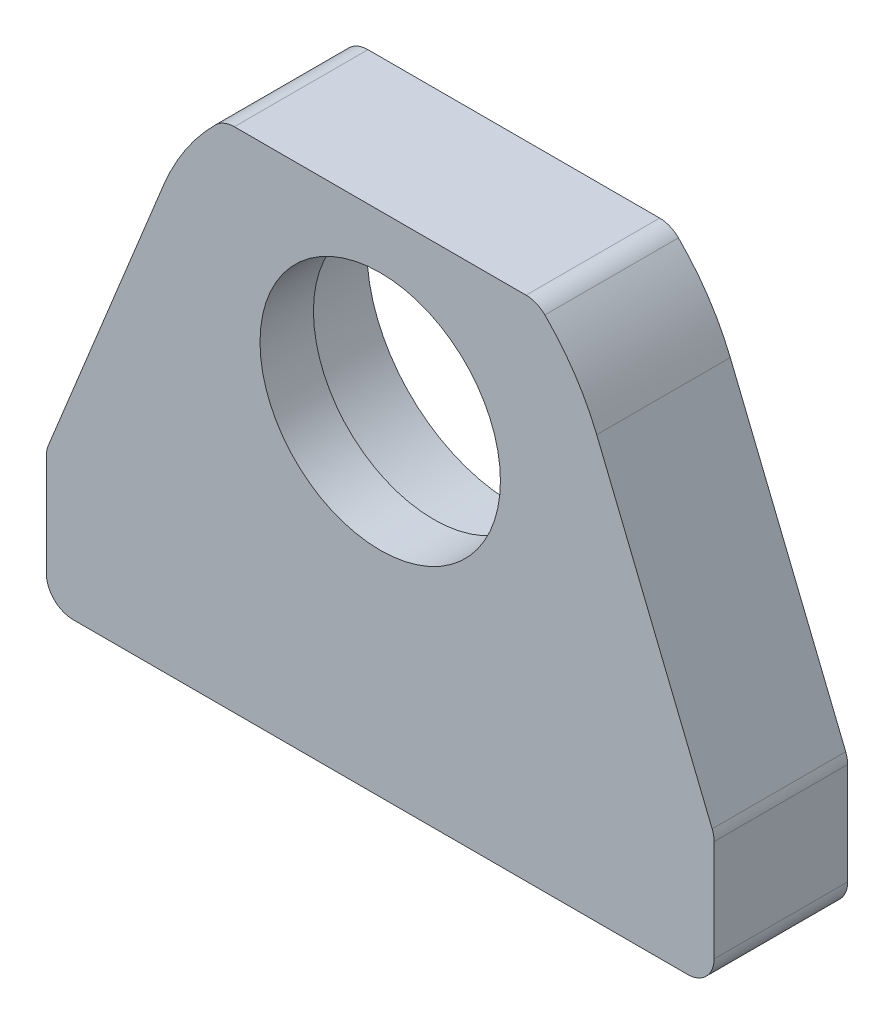
ISO-10303-21;
HEADER;
FILE_DESCRIPTION(('STEP AP214'),'2;1');
FILE_NAME('part.step','',(''),(''),'','','');
FILE_SCHEMA(('AUTOMOTIVE_DESIGN { 1 0 10303 214 1 1 1 1 }'));
ENDSEC;
DATA;
#1=APPLICATION_CONTEXT('core data for automotive mechanical design processes');
#2=APPLICATION_PROTOCOL_DEFINITION('international standard','automotive_design',2000,#1);
#3=PRODUCT_CONTEXT('',#1,'mechanical');
#4=PRODUCT('Part','Part','',(#3));
#5=PRODUCT_RELATED_PRODUCT_CATEGORY('part','',(#4));
#6=PRODUCT_DEFINITION_FORMATION('','',#4);
#7=PRODUCT_DEFINITION_CONTEXT('part definition',#1,'design');
#8=PRODUCT_DEFINITION('design','',#6,#7);
#9=PRODUCT_DEFINITION_SHAPE('','',#8);
#10=(LENGTH_UNIT() NAMED_UNIT(*) SI_UNIT(.MILLI.,.METRE.));
#11=(NAMED_UNIT(*) PLANE_ANGLE_UNIT() SI_UNIT($,.RADIAN.));
#12=(NAMED_UNIT(*) SI_UNIT($,.STERADIAN.) SOLID_ANGLE_UNIT());
#13=UNCERTAINTY_MEASURE_WITH_UNIT(LENGTH_MEASURE(1.E-05),#10,'distance_accuracy_value','');
#14=(GEOMETRIC_REPRESENTATION_CONTEXT(3) GLOBAL_UNCERTAINTY_ASSIGNED_CONTEXT((#13)) GLOBAL_UNIT_ASSIGNED_CONTEXT((#10,
#11,#12)) REPRESENTATION_CONTEXT('',''));
#15=CARTESIAN_POINT('',(0.,0.,0.));
#16=DIRECTION('',(0.,0.,1.));
#17=DIRECTION('',(1.,0.,0.));
#18=AXIS2_PLACEMENT_3D('',#15,#16,#17);
#19=CARTESIAN_POINT('',(25.,-15.,10.));
#20=DIRECTION('',(-1.,0.,0.));
#21=DIRECTION('',(0.,-1.,0.));
#22=AXIS2_PLACEMENT_3D('',#19,#20,#21);
#23=PLANE('',#22);
#24=DIRECTION('',(0.,1.,0.));
#25=VECTOR('',#24,1.);
#26=CARTESIAN_POINT('',(25.,-15.,10.));
#27=LINE('',#26,#25);
#28=CARTESIAN_POINT('',(25.,-23.,10.));
#29=VERTEX_POINT('',#28);
#30=CARTESIAN_POINT('',(25.,-15.3914563591869,10.));
#31=VERTEX_POINT('',#30);
#32=EDGE_CURVE('E150',#29,#31,#27,.T.);
#33=ORIENTED_EDGE('',*,*,#32,.F.);
#34=DIRECTION('',(0.,0.,-1.));
#35=VECTOR('',#34,1.);
#36=CARTESIAN_POINT('',(25.,-23.,10.));
#37=LINE('',#36,#35);
#38=CARTESIAN_POINT('',(25.,-23.,0.));
#39=VERTEX_POINT('',#38);
#40=EDGE_CURVE('E202',#29,#39,#37,.T.);
#41=ORIENTED_EDGE('',*,*,#40,.T.);
#42=DIRECTION('',(0.,1.,0.));
#43=VECTOR('',#42,1.);
#44=CARTESIAN_POINT('',(25.,-15.,0.));
#45=LINE('',#44,#43);
#46=CARTESIAN_POINT('',(25.,-15.3914563591869,0.));
#47=VERTEX_POINT('',#46);
#48=EDGE_CURVE('E179',#39,#47,#45,.T.);
#49=ORIENTED_EDGE('',*,*,#48,.T.);
#50=DIRECTION('',(0.,0.,-1.));
#51=VECTOR('',#50,1.);
#52=CARTESIAN_POINT('',(25.,-15.3914563591869,10.));
#53=LINE('',#52,#51);
#54=EDGE_CURVE('E160',#47,#31,#53,.F.);
#55=ORIENTED_EDGE('',*,*,#54,.T.);
#56=EDGE_LOOP('',(#33,#41,#49,#55));
#57=FACE_BOUND('',#56,.T.);
#58=ADVANCED_FACE('F35',(#57),#23,.F.);
#59=CARTESIAN_POINT('',(25.,-15.,10.));
#60=DIRECTION('',(-0.926207899400977,-0.377013165668295,0.));
#61=DIRECTION('',(0.377013165668295,-0.926207899400977,0.));
#62=AXIS2_PLACEMENT_3D('',#59,#60,#61);
#63=PLANE('',#62);
#64=DIRECTION('',(-0.377013165668295,0.926207899400977,0.));
#65=VECTOR('',#64,1.);
#66=CARTESIAN_POINT('',(25.,-15.,10.));
#67=LINE('',#66,#65);
#68=CARTESIAN_POINT('',(24.852415798802,-14.6374300278503,10.));
#69=VERTEX_POINT('',#68);
#70=CARTESIAN_POINT('',(16.2086382395171,6.59773039919516,10.));
#71=VERTEX_POINT('',#70);
#72=EDGE_CURVE('E137',#69,#71,#67,.T.);
#73=ORIENTED_EDGE('',*,*,#72,.F.);
#74=DIRECTION('',(0.,0.,-1.));
#75=VECTOR('',#74,1.);
#76=CARTESIAN_POINT('',(24.852415798802,-14.6374300278503,10.));
#77=LINE('',#76,#75);
#78=CARTESIAN_POINT('',(24.852415798802,-14.6374300278503,0.));
#79=VERTEX_POINT('',#78);
#80=EDGE_CURVE('E238',#69,#79,#77,.T.);
#81=ORIENTED_EDGE('',*,*,#80,.T.);
#82=DIRECTION('',(-0.377013165668295,0.926207899400977,0.));
#83=VECTOR('',#82,1.);
#84=CARTESIAN_POINT('',(25.,-15.,0.));
#85=LINE('',#84,#83);
#86=CARTESIAN_POINT('',(16.2086382395171,6.59773039919516,0.));
#87=VERTEX_POINT('',#86);
#88=EDGE_CURVE('E156',#79,#87,#85,.T.);
#89=ORIENTED_EDGE('',*,*,#88,.T.);
#90=DIRECTION('',(0.,0.,-1.));
#91=VECTOR('',#90,1.);
#92=CARTESIAN_POINT('',(16.2086382395171,6.59773039919516,10.));
#93=LINE('',#92,#91);
#94=EDGE_CURVE('E153',#71,#87,#93,.T.);
#95=ORIENTED_EDGE('',*,*,#94,.F.);
#96=EDGE_LOOP('',(#73,#81,#89,#95));
#97=FACE_BOUND('',#96,.T.);
#98=ADVANCED_FACE('F154',(#97),#63,.F.);
#99=CARTESIAN_POINT('',(0.,0.,10.));
#100=DIRECTION('',(0.,0.,-1.));
#101=DIRECTION('',(-1.,0.,0.));
#102=AXIS2_PLACEMENT_3D('',#99,#100,#101);
#103=CYLINDRICAL_SURFACE('',#102,17.5);
#104=CARTESIAN_POINT('',(0.,0.,0.));
#105=DIRECTION('',(0.,0.,1.));
#106=DIRECTION('',(1.,0.,0.));
#107=AXIS2_PLACEMENT_3D('',#104,#105,#106);
#108=CIRCLE('',#107,17.5);
#109=CARTESIAN_POINT('',(12.3292183608783,12.4193548387097,0.));
#110=VERTEX_POINT('',#109);
#111=EDGE_CURVE('E184',#87,#110,#108,.T.);
#112=ORIENTED_EDGE('',*,*,#111,.T.);
#113=DIRECTION('',(0.,0.,-1.));
#114=VECTOR('',#113,1.);
#115=CARTESIAN_POINT('',(12.3292183608783,12.4193548387097,10.));
#116=LINE('',#115,#114);
#117=CARTESIAN_POINT('',(12.3292183608783,12.4193548387097,10.));
#118=VERTEX_POINT('',#117);
#119=EDGE_CURVE('E43',#110,#118,#116,.F.);
#120=ORIENTED_EDGE('',*,*,#119,.T.);
#121=CARTESIAN_POINT('',(0.,0.,10.));
#122=DIRECTION('',(0.,0.,1.));
#123=DIRECTION('',(1.,0.,0.));
#124=AXIS2_PLACEMENT_3D('',#121,#122,#123);
#125=CIRCLE('',#124,17.5);
#126=EDGE_CURVE('E142',#71,#118,#125,.T.);
#127=ORIENTED_EDGE('',*,*,#126,.F.);
#128=ORIENTED_EDGE('',*,*,#94,.T.);
#129=EDGE_LOOP('',(#112,#120,#127,#128));
#130=FACE_BOUND('',#129,.T.);
#131=ADVANCED_FACE('F163',(#130),#103,.T.);
#132=CARTESIAN_POINT('',(-11.71537451386,13.,10.));
#133=DIRECTION('',(0.,-1.,0.));
#134=DIRECTION('',(0.,0.,-1.));
#135=AXIS2_PLACEMENT_3D('',#132,#133,#134);
#136=PLANE('',#135);
#137=DIRECTION('',(-1.,0.,0.));
#138=VECTOR('',#137,1.);
#139=CARTESIAN_POINT('',(-11.71537451386,13.,10.));
#140=LINE('',#139,#138);
#141=CARTESIAN_POINT('',(10.9201648339208,13.,10.));
#142=VERTEX_POINT('',#141);
#143=CARTESIAN_POINT('',(-10.9201648339208,13.,10.));
#144=VERTEX_POINT('',#143);
#145=EDGE_CURVE('E165',#142,#144,#140,.T.);
#146=ORIENTED_EDGE('',*,*,#145,.F.);
#147=DIRECTION('',(0.,0.,-1.));
#148=VECTOR('',#147,1.);
#149=CARTESIAN_POINT('',(10.9201648339208,13.,10.));
#150=LINE('',#149,#148);
#151=CARTESIAN_POINT('',(10.9201648339208,13.,0.));
#152=VERTEX_POINT('',#151);
#153=EDGE_CURVE('E242',#142,#152,#150,.T.);
#154=ORIENTED_EDGE('',*,*,#153,.T.);
#155=DIRECTION('',(-1.,0.,0.));
#156=VECTOR('',#155,1.);
#157=CARTESIAN_POINT('',(-11.71537451386,13.,0.));
#158=LINE('',#157,#156);
#159=CARTESIAN_POINT('',(-10.9201648339208,13.,0.));
#160=VERTEX_POINT('',#159);
#161=EDGE_CURVE('E186',#152,#160,#158,.T.);
#162=ORIENTED_EDGE('',*,*,#161,.T.);
#163=DIRECTION('',(0.,0.,-1.));
#164=VECTOR('',#163,1.);
#165=CARTESIAN_POINT('',(-10.9201648339208,13.,10.));
#166=LINE('',#165,#164);
#167=EDGE_CURVE('E240',#160,#144,#166,.F.);
#168=ORIENTED_EDGE('',*,*,#167,.T.);
#169=EDGE_LOOP('',(#146,#154,#162,#168));
#170=FACE_BOUND('',#169,.T.);
#171=ADVANCED_FACE('F248',(#170),#136,.F.);
#172=CARTESIAN_POINT('',(0.,0.,10.));
#173=DIRECTION('',(0.,0.,-1.));
#174=DIRECTION('',(-1.,0.,0.));
#175=AXIS2_PLACEMENT_3D('',#172,#173,#174);
#176=CYLINDRICAL_SURFACE('',#175,17.5);
#177=CARTESIAN_POINT('',(0.,0.,10.));
#178=DIRECTION('',(0.,0.,1.));
#179=DIRECTION('',(1.,0.,0.));
#180=AXIS2_PLACEMENT_3D('',#177,#178,#179);
#181=CIRCLE('',#180,17.5);
#182=CARTESIAN_POINT('',(-12.3292183608783,12.4193548387097,10.));
#183=VERTEX_POINT('',#182);
#184=CARTESIAN_POINT('',(-16.2086382395171,6.59773039919516,10.));
#185=VERTEX_POINT('',#184);
#186=EDGE_CURVE('E168',#183,#185,#181,.T.);
#187=ORIENTED_EDGE('',*,*,#186,.F.);
#188=DIRECTION('',(0.,0.,-1.));
#189=VECTOR('',#188,1.);
#190=CARTESIAN_POINT('',(-12.3292183608783,12.4193548387097,10.));
#191=LINE('',#190,#189);
#192=CARTESIAN_POINT('',(-12.3292183608783,12.4193548387097,0.));
#193=VERTEX_POINT('',#192);
#194=EDGE_CURVE('E11',#183,#193,#191,.T.);
#195=ORIENTED_EDGE('',*,*,#194,.T.);
#196=CARTESIAN_POINT('',(0.,0.,0.));
#197=DIRECTION('',(0.,0.,1.));
#198=DIRECTION('',(1.,0.,0.));
#199=AXIS2_PLACEMENT_3D('',#196,#197,#198);
#200=CIRCLE('',#199,17.5);
#201=CARTESIAN_POINT('',(-16.2086382395171,6.59773039919516,0.));
#202=VERTEX_POINT('',#201);
#203=EDGE_CURVE('E189',#193,#202,#200,.T.);
#204=ORIENTED_EDGE('',*,*,#203,.T.);
#205=DIRECTION('',(0.,0.,-1.));
#206=VECTOR('',#205,1.);
#207=CARTESIAN_POINT('',(-16.2086382395171,6.59773039919516,10.));
#208=LINE('',#207,#206);
#209=EDGE_CURVE('E161',#185,#202,#208,.T.);
#210=ORIENTED_EDGE('',*,*,#209,.F.);
#211=EDGE_LOOP('',(#187,#195,#204,#210));
#212=FACE_BOUND('',#211,.T.);
#213=ADVANCED_FACE('F261',(#212),#176,.T.);
#214=CARTESIAN_POINT('',(-25.,-15.,10.));
#215=DIRECTION('',(0.926207899400977,-0.377013165668295,0.));
#216=DIRECTION('',(0.377013165668295,0.926207899400977,0.));
#217=AXIS2_PLACEMENT_3D('',#214,#215,#216);
#218=PLANE('',#217);
#219=DIRECTION('',(-0.377013165668295,-0.926207899400977,0.));
#220=VECTOR('',#219,1.);
#221=CARTESIAN_POINT('',(-25.,-15.,0.));
#222=LINE('',#221,#220);
#223=CARTESIAN_POINT('',(-24.852415798802,-14.6374300278503,0.));
#224=VERTEX_POINT('',#223);
#225=EDGE_CURVE('E191',#202,#224,#222,.T.);
#226=ORIENTED_EDGE('',*,*,#225,.T.);
#227=DIRECTION('',(0.,0.,-1.));
#228=VECTOR('',#227,1.);
#229=CARTESIAN_POINT('',(-24.852415798802,-14.6374300278503,10.));
#230=LINE('',#229,#228);
#231=CARTESIAN_POINT('',(-24.852415798802,-14.6374300278503,10.));
#232=VERTEX_POINT('',#231);
#233=EDGE_CURVE('E236',#224,#232,#230,.F.);
#234=ORIENTED_EDGE('',*,*,#233,.T.);
#235=DIRECTION('',(-0.377013165668295,-0.926207899400977,0.));
#236=VECTOR('',#235,1.);
#237=CARTESIAN_POINT('',(-25.,-15.,10.));
#238=LINE('',#237,#236);
#239=EDGE_CURVE('E173',#185,#232,#238,.T.);
#240=ORIENTED_EDGE('',*,*,#239,.F.);
#241=ORIENTED_EDGE('',*,*,#209,.T.);
#242=EDGE_LOOP('',(#226,#234,#240,#241));
#243=FACE_BOUND('',#242,.T.);
#244=ADVANCED_FACE('F368',(#243),#218,.F.);
#245=CARTESIAN_POINT('',(-25.,-15.,10.));
#246=DIRECTION('',(1.,0.,0.));
#247=DIRECTION('',(0.,0.,-1.));
#248=AXIS2_PLACEMENT_3D('',#245,#246,#247);
#249=PLANE('',#248);
#250=DIRECTION('',(0.,-1.,0.));
#251=VECTOR('',#250,1.);
#252=CARTESIAN_POINT('',(-25.,-15.,0.));
#253=LINE('',#252,#251);
#254=CARTESIAN_POINT('',(-25.,-15.3914563591869,0.));
#255=VERTEX_POINT('',#254);
#256=CARTESIAN_POINT('',(-25.,-23.,0.));
#257=VERTEX_POINT('',#256);
#258=EDGE_CURVE('E194',#255,#257,#253,.T.);
#259=ORIENTED_EDGE('',*,*,#258,.T.);
#260=DIRECTION('',(0.,0.,-1.));
#261=VECTOR('',#260,1.);
#262=CARTESIAN_POINT('',(-25.,-23.,10.));
#263=LINE('',#262,#261);
#264=CARTESIAN_POINT('',(-25.,-23.,10.));
#265=VERTEX_POINT('',#264);
#266=EDGE_CURVE('E50',#257,#265,#263,.F.);
#267=ORIENTED_EDGE('',*,*,#266,.T.);
#268=DIRECTION('',(0.,-1.,0.));
#269=VECTOR('',#268,1.);
#270=CARTESIAN_POINT('',(-25.,-15.,10.));
#271=LINE('',#270,#269);
#272=CARTESIAN_POINT('',(-25.,-15.3914563591869,10.));
#273=VERTEX_POINT('',#272);
#274=EDGE_CURVE('E175',#273,#265,#271,.T.);
#275=ORIENTED_EDGE('',*,*,#274,.F.);
#276=DIRECTION('',(0.,0.,-1.));
#277=VECTOR('',#276,1.);
#278=CARTESIAN_POINT('',(-25.,-15.3914563591869,10.));
#279=LINE('',#278,#277);
#280=EDGE_CURVE('E232',#273,#255,#279,.T.);
#281=ORIENTED_EDGE('',*,*,#280,.T.);
#282=EDGE_LOOP('',(#259,#267,#275,#281));
#283=FACE_BOUND('',#282,.T.);
#284=ADVANCED_FACE('F300',(#283),#249,.F.);
#285=CARTESIAN_POINT('',(-25.,-25.,10.));
#286=DIRECTION('',(0.,1.,0.));
#287=DIRECTION('',(-1.,0.,0.));
#288=AXIS2_PLACEMENT_3D('',#285,#286,#287);
#289=PLANE('',#288);
#290=CARTESIAN_POINT('',(-20.,-25.,5.));
#291=DIRECTION('',(0.,-1.,0.));
#292=DIRECTION('',(1.,0.,0.));
#293=AXIS2_PLACEMENT_3D('',#290,#291,#292);
#294=CIRCLE('',#293,1.65);
#295=CARTESIAN_POINT('',(-18.35,-25.,5.));
#296=VERTEX_POINT('',#295);
#297=EDGE_CURVE('E325',#296,#296,#294,.T.);
#298=ORIENTED_EDGE('',*,*,#297,.F.);
#299=EDGE_LOOP('',(#298));
#300=FACE_BOUND('',#299,.T.);
#301=CARTESIAN_POINT('',(20.,-25.,5.));
#302=DIRECTION('',(0.,-1.,0.));
#303=DIRECTION('',(-1.,0.,0.));
#304=AXIS2_PLACEMENT_3D('',#301,#302,#303);
#305=CIRCLE('',#304,1.65);
#306=CARTESIAN_POINT('',(18.35,-25.,5.));
#307=VERTEX_POINT('',#306);
#308=EDGE_CURVE('E318',#307,#307,#305,.T.);
#309=ORIENTED_EDGE('',*,*,#308,.F.);
#310=EDGE_LOOP('',(#309));
#311=FACE_BOUND('',#310,.T.);
#312=DIRECTION('',(1.,0.,0.));
#313=VECTOR('',#312,1.);
#314=CARTESIAN_POINT('',(-25.,-25.,0.));
#315=LINE('',#314,#313);
#316=CARTESIAN_POINT('',(-23.,-25.,0.));
#317=VERTEX_POINT('',#316);
#318=CARTESIAN_POINT('',(23.,-25.,0.));
#319=VERTEX_POINT('',#318);
#320=EDGE_CURVE('E196',#317,#319,#315,.T.);
#321=ORIENTED_EDGE('',*,*,#320,.T.);
#322=DIRECTION('',(0.,0.,-1.));
#323=VECTOR('',#322,1.);
#324=CARTESIAN_POINT('',(23.,-25.,10.));
#325=LINE('',#324,#323);
#326=CARTESIAN_POINT('',(23.,-25.,10.));
#327=VERTEX_POINT('',#326);
#328=EDGE_CURVE('E220',#319,#327,#325,.F.);
#329=ORIENTED_EDGE('',*,*,#328,.T.);
#330=DIRECTION('',(1.,0.,0.));
#331=VECTOR('',#330,1.);
#332=CARTESIAN_POINT('',(-25.,-25.,10.));
#333=LINE('',#332,#331);
#334=CARTESIAN_POINT('',(-23.,-25.,10.));
#335=VERTEX_POINT('',#334);
#336=EDGE_CURVE('E177',#335,#327,#333,.T.);
#337=ORIENTED_EDGE('',*,*,#336,.F.);
#338=DIRECTION('',(0.,0.,-1.));
#339=VECTOR('',#338,1.);
#340=CARTESIAN_POINT('',(-23.,-25.,10.));
#341=LINE('',#340,#339);
#342=EDGE_CURVE('E217',#335,#317,#341,.T.);
#343=ORIENTED_EDGE('',*,*,#342,.T.);
#344=EDGE_LOOP('',(#321,#329,#337,#343));
#345=FACE_BOUND('',#344,.T.);
#346=ADVANCED_FACE('F306',(#300,#311,#345),#289,.F.);
#347=CARTESIAN_POINT('',(0.,0.,10.));
#348=DIRECTION('',(0.,0.,1.));
#349=DIRECTION('',(1.,0.,0.));
#350=AXIS2_PLACEMENT_3D('',#347,#348,#349);
#351=PLANE('',#350);
#352=CARTESIAN_POINT('',(0.,0.,10.));
#353=DIRECTION('',(0.,0.,-1.));
#354=DIRECTION('',(-1.,0.,0.));
#355=AXIS2_PLACEMENT_3D('',#352,#353,#354);
#356=CIRCLE('',#355,9.);
#357=CARTESIAN_POINT('',(-9.,0.,10.));
#358=VERTEX_POINT('',#357);
#359=EDGE_CURVE('E322',#358,#358,#356,.T.);
#360=ORIENTED_EDGE('',*,*,#359,.T.);
#361=EDGE_LOOP('',(#360));
#362=FACE_BOUND('',#361,.T.);
#363=ORIENTED_EDGE('',*,*,#336,.T.);
#364=CARTESIAN_POINT('',(23.,-23.,10.));
#365=DIRECTION('',(0.,0.,1.));
#366=DIRECTION('',(1.,0.,0.));
#367=AXIS2_PLACEMENT_3D('',#364,#365,#366);
#368=CIRCLE('',#367,2.);
#369=EDGE_CURVE('E230',#327,#29,#368,.T.);
#370=ORIENTED_EDGE('',*,*,#369,.T.);
#371=ORIENTED_EDGE('',*,*,#32,.T.);
#372=CARTESIAN_POINT('',(23.,-15.3914563591869,10.));
#373=DIRECTION('',(0.,0.,1.));
#374=DIRECTION('',(1.,0.,0.));
#375=AXIS2_PLACEMENT_3D('',#372,#373,#374);
#376=CIRCLE('',#375,2.);
#377=EDGE_CURVE('E146',#31,#69,#376,.T.);
#378=ORIENTED_EDGE('',*,*,#377,.T.);
#379=ORIENTED_EDGE('',*,*,#72,.T.);
#380=ORIENTED_EDGE('',*,*,#126,.T.);
#381=CARTESIAN_POINT('',(10.9201648339208,11.,10.));
#382=DIRECTION('',(0.,0.,1.));
#383=DIRECTION('',(1.,0.,0.));
#384=AXIS2_PLACEMENT_3D('',#381,#382,#383);
#385=CIRCLE('',#384,2.);
#386=EDGE_CURVE('E224',#118,#142,#385,.T.);
#387=ORIENTED_EDGE('',*,*,#386,.T.);
#388=ORIENTED_EDGE('',*,*,#145,.T.);
#389=CARTESIAN_POINT('',(-10.9201648339208,11.,10.));
#390=DIRECTION('',(0.,0.,1.));
#391=DIRECTION('',(1.,0.,0.));
#392=AXIS2_PLACEMENT_3D('',#389,#390,#391);
#393=CIRCLE('',#392,2.);
#394=EDGE_CURVE('E222',#144,#183,#393,.T.);
#395=ORIENTED_EDGE('',*,*,#394,.T.);
#396=ORIENTED_EDGE('',*,*,#186,.T.);
#397=ORIENTED_EDGE('',*,*,#239,.T.);
#398=CARTESIAN_POINT('',(-23.,-15.3914563591869,10.));
#399=DIRECTION('',(0.,0.,1.));
#400=DIRECTION('',(1.,0.,0.));
#401=AXIS2_PLACEMENT_3D('',#398,#399,#400);
#402=CIRCLE('',#401,2.);
#403=EDGE_CURVE('E57',#232,#273,#402,.T.);
#404=ORIENTED_EDGE('',*,*,#403,.T.);
#405=ORIENTED_EDGE('',*,*,#274,.T.);
#406=CARTESIAN_POINT('',(-23.,-23.,10.));
#407=DIRECTION('',(0.,0.,1.));
#408=DIRECTION('',(1.,0.,0.));
#409=AXIS2_PLACEMENT_3D('',#406,#407,#408);
#410=CIRCLE('',#409,2.);
#411=EDGE_CURVE('E228',#265,#335,#410,.T.);
#412=ORIENTED_EDGE('',*,*,#411,.T.);
#413=EDGE_LOOP('',(#363,#370,#371,#378,#379,#380,#387,#388,#395,#396,#397,#404,#405,#412));
#414=FACE_BOUND('',#413,.T.);
#415=ADVANCED_FACE('F140',(#362,#414),#351,.T.);
#416=CARTESIAN_POINT('',(0.,0.,0.));
#417=DIRECTION('',(0.,0.,1.));
#418=DIRECTION('',(1.,0.,0.));
#419=AXIS2_PLACEMENT_3D('',#416,#417,#418);
#420=PLANE('',#419);
#421=CARTESIAN_POINT('',(0.,0.,0.));
#422=DIRECTION('',(0.,0.,-1.));
#423=DIRECTION('',(-1.,0.,0.));
#424=AXIS2_PLACEMENT_3D('',#421,#422,#423);
#425=CIRCLE('',#424,11.);
#426=CARTESIAN_POINT('',(-11.,0.,0.));
#427=VERTEX_POINT('',#426);
#428=EDGE_CURVE('E312',#427,#427,#425,.T.);
#429=ORIENTED_EDGE('',*,*,#428,.F.);
#430=EDGE_LOOP('',(#429));
#431=FACE_BOUND('',#430,.T.);
#432=ORIENTED_EDGE('',*,*,#48,.F.);
#433=CARTESIAN_POINT('',(23.,-23.,0.));
#434=DIRECTION('',(0.,0.,1.));
#435=DIRECTION('',(1.,0.,0.));
#436=AXIS2_PLACEMENT_3D('',#433,#434,#435);
#437=CIRCLE('',#436,2.);
#438=EDGE_CURVE('E215',#39,#319,#437,.F.);
#439=ORIENTED_EDGE('',*,*,#438,.T.);
#440=ORIENTED_EDGE('',*,*,#320,.F.);
#441=CARTESIAN_POINT('',(-23.,-23.,0.));
#442=DIRECTION('',(0.,0.,1.));
#443=DIRECTION('',(1.,0.,0.));
#444=AXIS2_PLACEMENT_3D('',#441,#442,#443);
#445=CIRCLE('',#444,2.);
#446=EDGE_CURVE('E213',#317,#257,#445,.F.);
#447=ORIENTED_EDGE('',*,*,#446,.T.);
#448=ORIENTED_EDGE('',*,*,#258,.F.);
#449=CARTESIAN_POINT('',(-23.,-15.3914563591869,0.));
#450=DIRECTION('',(0.,0.,1.));
#451=DIRECTION('',(1.,0.,0.));
#452=AXIS2_PLACEMENT_3D('',#449,#450,#451);
#453=CIRCLE('',#452,2.);
#454=EDGE_CURVE('E211',#255,#224,#453,.F.);
#455=ORIENTED_EDGE('',*,*,#454,.T.);
#456=ORIENTED_EDGE('',*,*,#225,.F.);
#457=ORIENTED_EDGE('',*,*,#203,.F.);
#458=CARTESIAN_POINT('',(-10.9201648339208,11.,0.));
#459=DIRECTION('',(0.,0.,1.));
#460=DIRECTION('',(1.,0.,0.));
#461=AXIS2_PLACEMENT_3D('',#458,#459,#460);
#462=CIRCLE('',#461,2.);
#463=EDGE_CURVE('E205',#193,#160,#462,.F.);
#464=ORIENTED_EDGE('',*,*,#463,.T.);
#465=ORIENTED_EDGE('',*,*,#161,.F.);
#466=CARTESIAN_POINT('',(10.9201648339208,11.,0.));
#467=DIRECTION('',(0.,0.,1.));
#468=DIRECTION('',(1.,0.,0.));
#469=AXIS2_PLACEMENT_3D('',#466,#467,#468);
#470=CIRCLE('',#469,2.);
#471=EDGE_CURVE('E207',#152,#110,#470,.F.);
#472=ORIENTED_EDGE('',*,*,#471,.T.);
#473=ORIENTED_EDGE('',*,*,#111,.F.);
#474=ORIENTED_EDGE('',*,*,#88,.F.);
#475=CARTESIAN_POINT('',(23.,-15.3914563591869,0.));
#476=DIRECTION('',(0.,0.,1.));
#477=DIRECTION('',(1.,0.,0.));
#478=AXIS2_PLACEMENT_3D('',#475,#476,#477);
#479=CIRCLE('',#478,2.);
#480=EDGE_CURVE('E209',#79,#47,#479,.F.);
#481=ORIENTED_EDGE('',*,*,#480,.T.);
#482=EDGE_LOOP('',(#432,#439,#440,#447,#448,#455,#456,#457,#464,#465,#472,#473,#474,#481));
#483=FACE_BOUND('',#482,.T.);
#484=ADVANCED_FACE('F253',(#431,#483),#420,.F.);
#485=CARTESIAN_POINT('',(0.,0.,6.));
#486=DIRECTION('',(0.,0.,-1.));
#487=DIRECTION('',(-1.,0.,0.));
#488=AXIS2_PLACEMENT_3D('',#485,#486,#487);
#489=CYLINDRICAL_SURFACE('',#488,11.);
#490=CARTESIAN_POINT('',(0.,0.,6.));
#491=DIRECTION('',(0.,0.,-1.));
#492=DIRECTION('',(-1.,0.,0.));
#493=AXIS2_PLACEMENT_3D('',#490,#491,#492);
#494=CIRCLE('',#493,11.);
#495=CARTESIAN_POINT('',(-11.,0.,6.));
#496=VERTEX_POINT('',#495);
#497=EDGE_CURVE('E182',#496,#496,#494,.T.);
#498=ORIENTED_EDGE('',*,*,#497,.F.);
#499=EDGE_LOOP('',(#498));
#500=FACE_BOUND('',#499,.T.);
#501=ORIENTED_EDGE('',*,*,#428,.T.);
#502=EDGE_LOOP('',(#501));
#503=FACE_BOUND('',#502,.T.);
#504=ADVANCED_FACE('F347',(#500,#503),#489,.F.);
#505=CARTESIAN_POINT('',(0.,0.,6.));
#506=DIRECTION('',(0.,0.,-1.));
#507=DIRECTION('',(-1.,0.,0.));
#508=AXIS2_PLACEMENT_3D('',#505,#506,#507);
#509=PLANE('',#508);
#510=CARTESIAN_POINT('',(0.,0.,6.));
#511=DIRECTION('',(0.,0.,-1.));
#512=DIRECTION('',(-1.,0.,0.));
#513=AXIS2_PLACEMENT_3D('',#510,#511,#512);
#514=CIRCLE('',#513,9.);
#515=CARTESIAN_POINT('',(-9.,0.,6.));
#516=VERTEX_POINT('',#515);
#517=EDGE_CURVE('E330',#516,#516,#514,.T.);
#518=ORIENTED_EDGE('',*,*,#517,.F.);
#519=EDGE_LOOP('',(#518));
#520=FACE_BOUND('',#519,.T.);
#521=ORIENTED_EDGE('',*,*,#497,.T.);
#522=EDGE_LOOP('',(#521));
#523=FACE_BOUND('',#522,.T.);
#524=ADVANCED_FACE('F343',(#520,#523),#509,.T.);
#525=CARTESIAN_POINT('',(20.,-15.,5.));
#526=DIRECTION('',(0.,-1.,0.));
#527=DIRECTION('',(1.,0.,0.));
#528=AXIS2_PLACEMENT_3D('',#525,#526,#527);
#529=CYLINDRICAL_SURFACE('',#528,1.65);
#530=CARTESIAN_POINT('',(20.,-15.,5.));
#531=DIRECTION('',(0.,-1.,0.));
#532=DIRECTION('',(-1.,0.,0.));
#533=AXIS2_PLACEMENT_3D('',#530,#531,#532);
#534=CIRCLE('',#533,1.65);
#535=CARTESIAN_POINT('',(18.35,-15.,5.));
#536=VERTEX_POINT('',#535);
#537=EDGE_CURVE('E321',#536,#536,#534,.T.);
#538=ORIENTED_EDGE('',*,*,#537,.F.);
#539=EDGE_LOOP('',(#538));
#540=FACE_BOUND('',#539,.T.);
#541=ORIENTED_EDGE('',*,*,#308,.T.);
#542=EDGE_LOOP('',(#541));
#543=FACE_BOUND('',#542,.T.);
#544=ADVANCED_FACE('F346',(#540,#543),#529,.F.);
#545=CARTESIAN_POINT('',(20.,-15.,5.));
#546=DIRECTION('',(0.,1.,0.));
#547=DIRECTION('',(-1.,0.,0.));
#548=AXIS2_PLACEMENT_3D('',#545,#546,#547);
#549=PLANE('',#548);
#550=ORIENTED_EDGE('',*,*,#537,.T.);
#551=EDGE_LOOP('',(#550));
#552=FACE_BOUND('',#551,.T.);
#553=ADVANCED_FACE('F462',(#552),#549,.F.);
#554=CARTESIAN_POINT('',(-20.,-15.,5.));
#555=DIRECTION('',(0.,-1.,0.));
#556=DIRECTION('',(1.,0.,0.));
#557=AXIS2_PLACEMENT_3D('',#554,#555,#556);
#558=CYLINDRICAL_SURFACE('',#557,1.65);
#559=CARTESIAN_POINT('',(-20.,-15.,5.));
#560=DIRECTION('',(0.,-1.,0.));
#561=DIRECTION('',(1.,0.,0.));
#562=AXIS2_PLACEMENT_3D('',#559,#560,#561);
#563=CIRCLE('',#562,1.65);
#564=CARTESIAN_POINT('',(-18.35,-15.,5.));
#565=VERTEX_POINT('',#564);
#566=EDGE_CURVE('E315',#565,#565,#563,.T.);
#567=ORIENTED_EDGE('',*,*,#566,.F.);
#568=EDGE_LOOP('',(#567));
#569=FACE_BOUND('',#568,.T.);
#570=ORIENTED_EDGE('',*,*,#297,.T.);
#571=EDGE_LOOP('',(#570));
#572=FACE_BOUND('',#571,.T.);
#573=ADVANCED_FACE('F454',(#569,#572),#558,.F.);
#574=CARTESIAN_POINT('',(-20.,-15.,5.));
#575=DIRECTION('',(0.,-1.,0.));
#576=DIRECTION('',(1.,0.,0.));
#577=AXIS2_PLACEMENT_3D('',#574,#575,#576);
#578=PLANE('',#577);
#579=ORIENTED_EDGE('',*,*,#566,.T.);
#580=EDGE_LOOP('',(#579));
#581=FACE_BOUND('',#580,.T.);
#582=ADVANCED_FACE('F339',(#581),#578,.T.);
#583=CARTESIAN_POINT('',(0.,0.,10.));
#584=DIRECTION('',(0.,0.,-1.));
#585=DIRECTION('',(-1.,0.,0.));
#586=AXIS2_PLACEMENT_3D('',#583,#584,#585);
#587=CYLINDRICAL_SURFACE('',#586,9.);
#588=ORIENTED_EDGE('',*,*,#359,.F.);
#589=EDGE_LOOP('',(#588));
#590=FACE_BOUND('',#589,.T.);
#591=ORIENTED_EDGE('',*,*,#517,.T.);
#592=EDGE_LOOP('',(#591));
#593=FACE_BOUND('',#592,.T.);
#594=ADVANCED_FACE('F288',(#590,#593),#587,.F.);
#595=CARTESIAN_POINT('',(23.,-23.,10.));
#596=DIRECTION('',(0.,0.,-1.));
#597=DIRECTION('',(-1.,0.,0.));
#598=AXIS2_PLACEMENT_3D('',#595,#596,#597);
#599=CYLINDRICAL_SURFACE('',#598,2.);
#600=ORIENTED_EDGE('',*,*,#369,.F.);
#601=ORIENTED_EDGE('',*,*,#328,.F.);
#602=ORIENTED_EDGE('',*,*,#438,.F.);
#603=ORIENTED_EDGE('',*,*,#40,.F.);
#604=EDGE_LOOP('',(#600,#601,#602,#603));
#605=FACE_BOUND('',#604,.T.);
#606=ADVANCED_FACE('F284',(#605),#599,.T.);
#607=CARTESIAN_POINT('',(-23.,-23.,10.));
#608=DIRECTION('',(0.,0.,-1.));
#609=DIRECTION('',(-1.,0.,0.));
#610=AXIS2_PLACEMENT_3D('',#607,#608,#609);
#611=CYLINDRICAL_SURFACE('',#610,2.);
#612=ORIENTED_EDGE('',*,*,#411,.F.);
#613=ORIENTED_EDGE('',*,*,#266,.F.);
#614=ORIENTED_EDGE('',*,*,#446,.F.);
#615=ORIENTED_EDGE('',*,*,#342,.F.);
#616=EDGE_LOOP('',(#612,#613,#614,#615));
#617=FACE_BOUND('',#616,.T.);
#618=ADVANCED_FACE('F287',(#617),#611,.T.);
#619=CARTESIAN_POINT('',(-23.,-15.3914563591869,10.));
#620=DIRECTION('',(0.,0.,-1.));
#621=DIRECTION('',(-1.,0.,0.));
#622=AXIS2_PLACEMENT_3D('',#619,#620,#621);
#623=CYLINDRICAL_SURFACE('',#622,2.);
#624=ORIENTED_EDGE('',*,*,#403,.F.);
#625=ORIENTED_EDGE('',*,*,#233,.F.);
#626=ORIENTED_EDGE('',*,*,#454,.F.);
#627=ORIENTED_EDGE('',*,*,#280,.F.);
#628=EDGE_LOOP('',(#624,#625,#626,#627));
#629=FACE_BOUND('',#628,.T.);
#630=ADVANCED_FACE('F271',(#629),#623,.T.);
#631=CARTESIAN_POINT('',(23.,-15.3914563591869,10.));
#632=DIRECTION('',(0.,0.,-1.));
#633=DIRECTION('',(-1.,0.,0.));
#634=AXIS2_PLACEMENT_3D('',#631,#632,#633);
#635=CYLINDRICAL_SURFACE('',#634,2.);
#636=ORIENTED_EDGE('',*,*,#377,.F.);
#637=ORIENTED_EDGE('',*,*,#54,.F.);
#638=ORIENTED_EDGE('',*,*,#480,.F.);
#639=ORIENTED_EDGE('',*,*,#80,.F.);
#640=EDGE_LOOP('',(#636,#637,#638,#639));
#641=FACE_BOUND('',#640,.T.);
#642=ADVANCED_FACE('F266',(#641),#635,.T.);
#643=CARTESIAN_POINT('',(10.9201648339208,11.,10.));
#644=DIRECTION('',(0.,0.,-1.));
#645=DIRECTION('',(-1.,0.,0.));
#646=AXIS2_PLACEMENT_3D('',#643,#644,#645);
#647=CYLINDRICAL_SURFACE('',#646,2.);
#648=ORIENTED_EDGE('',*,*,#386,.F.);
#649=ORIENTED_EDGE('',*,*,#119,.F.);
#650=ORIENTED_EDGE('',*,*,#471,.F.);
#651=ORIENTED_EDGE('',*,*,#153,.F.);
#652=EDGE_LOOP('',(#648,#649,#650,#651));
#653=FACE_BOUND('',#652,.T.);
#654=ADVANCED_FACE('F264',(#653),#647,.T.);
#655=CARTESIAN_POINT('',(-10.9201648339208,11.,10.));
#656=DIRECTION('',(0.,0.,-1.));
#657=DIRECTION('',(-1.,0.,0.));
#658=AXIS2_PLACEMENT_3D('',#655,#656,#657);
#659=CYLINDRICAL_SURFACE('',#658,2.);
#660=ORIENTED_EDGE('',*,*,#394,.F.);
#661=ORIENTED_EDGE('',*,*,#167,.F.);
#662=ORIENTED_EDGE('',*,*,#463,.F.);
#663=ORIENTED_EDGE('',*,*,#194,.F.);
#664=EDGE_LOOP('',(#660,#661,#662,#663));
#665=FACE_BOUND('',#664,.T.);
#666=ADVANCED_FACE('F37',(#665),#659,.T.);
#667=CLOSED_SHELL('',(#58,#98,#131,#171,#213,#244,#284,#346,#415,#484,#504,#524,#544,#553,#573,
#582,#594,#606,#618,#630,#642,#654,#666));
#668=MANIFOLD_SOLID_BREP('B2',#667);
#669=ADVANCED_BREP_SHAPE_REPRESENTATION('',(#18,#668),#14);
#670=SHAPE_DEFINITION_REPRESENTATION(#9,#669);
ENDSEC;
END-ISO-10303-21;
